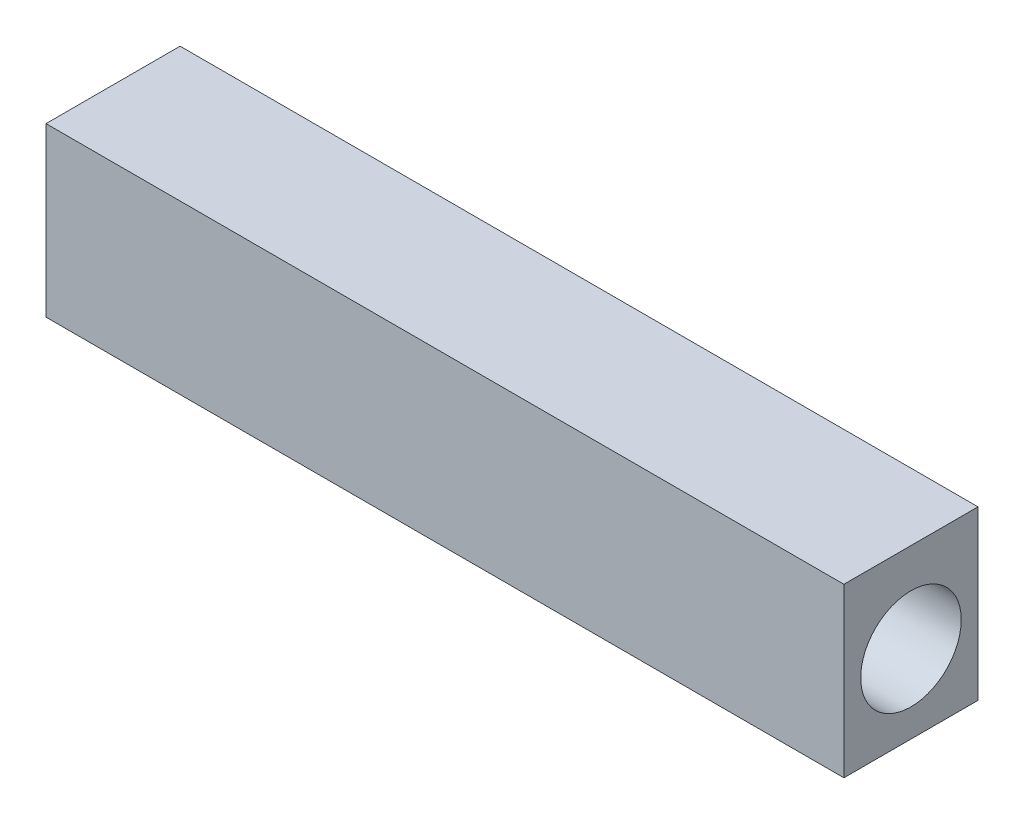
ISO-10303-21;
HEADER;
FILE_DESCRIPTION(('STEP AP214'),'2;1');
FILE_NAME('part.step','',(''),(''),'','','');
FILE_SCHEMA(('AUTOMOTIVE_DESIGN { 1 0 10303 214 1 1 1 1 }'));
ENDSEC;
DATA;
#1=APPLICATION_CONTEXT('core data for automotive mechanical design processes');
#2=APPLICATION_PROTOCOL_DEFINITION('international standard','automotive_design',2000,#1);
#3=PRODUCT_CONTEXT('',#1,'mechanical');
#4=PRODUCT('Part','Part','',(#3));
#5=PRODUCT_RELATED_PRODUCT_CATEGORY('part','',(#4));
#6=PRODUCT_DEFINITION_FORMATION('','',#4);
#7=PRODUCT_DEFINITION_CONTEXT('part definition',#1,'design');
#8=PRODUCT_DEFINITION('design','',#6,#7);
#9=PRODUCT_DEFINITION_SHAPE('','',#8);
#10=(LENGTH_UNIT() NAMED_UNIT(*) SI_UNIT(.MILLI.,.METRE.));
#11=(NAMED_UNIT(*) PLANE_ANGLE_UNIT() SI_UNIT($,.RADIAN.));
#12=(NAMED_UNIT(*) SI_UNIT($,.STERADIAN.) SOLID_ANGLE_UNIT());
#13=UNCERTAINTY_MEASURE_WITH_UNIT(LENGTH_MEASURE(1.E-05),#10,'distance_accuracy_value','');
#14=(GEOMETRIC_REPRESENTATION_CONTEXT(3) GLOBAL_UNCERTAINTY_ASSIGNED_CONTEXT((#13)) GLOBAL_UNIT_ASSIGNED_CONTEXT((#10,
#11,#12)) REPRESENTATION_CONTEXT('',''));
#15=CARTESIAN_POINT('',(0.,0.,0.));
#16=DIRECTION('',(0.,0.,1.));
#17=DIRECTION('',(1.,0.,0.));
#18=AXIS2_PLACEMENT_3D('',#15,#16,#17);
#19=CARTESIAN_POINT('',(-16.2,10.,-6.));
#20=DIRECTION('',(0.,0.,1.));
#21=DIRECTION('',(1.,0.,0.));
#22=AXIS2_PLACEMENT_3D('',#19,#20,#21);
#23=PLANE('',#22);
#24=DIRECTION('',(-1.,0.,0.));
#25=VECTOR('',#24,1.);
#26=CARTESIAN_POINT('',(-16.2,0.,-6.));
#27=LINE('',#26,#25);
#28=CARTESIAN_POINT('',(55.2,0.,-6.0000000000001));
#29=VERTEX_POINT('',#28);
#30=CARTESIAN_POINT('',(-16.2,0.,-6.));
#31=VERTEX_POINT('',#30);
#32=EDGE_CURVE('E112',#29,#31,#27,.T.);
#33=ORIENTED_EDGE('',*,*,#32,.T.);
#34=DIRECTION('',(0.,-1.,0.));
#35=VECTOR('',#34,1.);
#36=CARTESIAN_POINT('',(-16.2,10.,-6.));
#37=LINE('',#36,#35);
#38=CARTESIAN_POINT('',(-16.2,15.,-6.00000000000011));
#39=VERTEX_POINT('',#38);
#40=EDGE_CURVE('E40',#39,#31,#37,.T.);
#41=ORIENTED_EDGE('',*,*,#40,.F.);
#42=DIRECTION('',(-1.,0.,0.));
#43=VECTOR('',#42,1.);
#44=CARTESIAN_POINT('',(-16.2,15.,-6.00000000000011));
#45=LINE('',#44,#43);
#46=CARTESIAN_POINT('',(55.2,15.,-6.0000000000001));
#47=VERTEX_POINT('',#46);
#48=EDGE_CURVE('E73',#47,#39,#45,.T.);
#49=ORIENTED_EDGE('',*,*,#48,.F.);
#50=DIRECTION('',(0.,1.,0.));
#51=VECTOR('',#50,1.);
#52=CARTESIAN_POINT('',(55.2,15.,-6.0000000000001));
#53=LINE('',#52,#51);
#54=EDGE_CURVE('E76',#29,#47,#53,.T.);
#55=ORIENTED_EDGE('',*,*,#54,.F.);
#56=EDGE_LOOP('',(#33,#41,#49,#55));
#57=FACE_BOUND('',#56,.T.);
#58=ADVANCED_FACE('F33',(#57),#23,.F.);
#59=CARTESIAN_POINT('',(-16.2,10.,-6.));
#60=DIRECTION('',(1.,0.,0.));
#61=DIRECTION('',(0.,0.,-1.));
#62=AXIS2_PLACEMENT_3D('',#59,#60,#61);
#63=PLANE('',#62);
#64=DIRECTION('',(0.,0.,1.));
#65=VECTOR('',#64,1.);
#66=CARTESIAN_POINT('',(-16.2,0.,-6.));
#67=LINE('',#66,#65);
#68=CARTESIAN_POINT('',(-16.2,0.,6.));
#69=VERTEX_POINT('',#68);
#70=EDGE_CURVE('E116',#31,#69,#67,.T.);
#71=ORIENTED_EDGE('',*,*,#70,.T.);
#72=DIRECTION('',(0.,-1.,0.));
#73=VECTOR('',#72,1.);
#74=CARTESIAN_POINT('',(-16.2,10.,6.));
#75=LINE('',#74,#73);
#76=CARTESIAN_POINT('',(-16.2,15.,6.00000000000011));
#77=VERTEX_POINT('',#76);
#78=EDGE_CURVE('E47',#77,#69,#75,.T.);
#79=ORIENTED_EDGE('',*,*,#78,.F.);
#80=DIRECTION('',(0.,0.,1.));
#81=VECTOR('',#80,1.);
#82=CARTESIAN_POINT('',(-16.2,15.,-6.00000000000011));
#83=LINE('',#82,#81);
#84=EDGE_CURVE('E79',#39,#77,#83,.T.);
#85=ORIENTED_EDGE('',*,*,#84,.F.);
#86=ORIENTED_EDGE('',*,*,#40,.T.);
#87=EDGE_LOOP('',(#71,#79,#85,#86));
#88=FACE_BOUND('',#87,.T.);
#89=CARTESIAN_POINT('',(-16.2,7.,0.));
#90=DIRECTION('',(-1.,0.,0.));
#91=DIRECTION('',(0.,0.,1.));
#92=AXIS2_PLACEMENT_3D('',#89,#90,#91);
#93=CIRCLE('',#92,4.);
#94=CARTESIAN_POINT('',(-16.2,7.,4.));
#95=VERTEX_POINT('',#94);
#96=EDGE_CURVE('E108',#95,#95,#93,.T.);
#97=ORIENTED_EDGE('',*,*,#96,.F.);
#98=EDGE_LOOP('',(#97));
#99=FACE_BOUND('',#98,.T.);
#100=ADVANCED_FACE('F125',(#88,#99),#63,.F.);
#101=CARTESIAN_POINT('',(-16.2,10.,6.));
#102=DIRECTION('',(0.,0.,-1.));
#103=DIRECTION('',(-1.,0.,0.));
#104=AXIS2_PLACEMENT_3D('',#101,#102,#103);
#105=PLANE('',#104);
#106=DIRECTION('',(1.,0.,0.));
#107=VECTOR('',#106,1.);
#108=CARTESIAN_POINT('',(-16.2,0.,6.));
#109=LINE('',#108,#107);
#110=CARTESIAN_POINT('',(55.2,0.,6.00000000000001));
#111=VERTEX_POINT('',#110);
#112=EDGE_CURVE('E118',#69,#111,#109,.T.);
#113=ORIENTED_EDGE('',*,*,#112,.T.);
#114=DIRECTION('',(0.,-1.,0.));
#115=VECTOR('',#114,1.);
#116=CARTESIAN_POINT('',(55.2,15.,6.00000000000001));
#117=LINE('',#116,#115);
#118=CARTESIAN_POINT('',(55.2,15.,6.00000000000001));
#119=VERTEX_POINT('',#118);
#120=EDGE_CURVE('E88',#119,#111,#117,.T.);
#121=ORIENTED_EDGE('',*,*,#120,.F.);
#122=DIRECTION('',(1.,0.,0.));
#123=VECTOR('',#122,1.);
#124=CARTESIAN_POINT('',(-16.2,15.,6.00000000000011));
#125=LINE('',#124,#123);
#126=EDGE_CURVE('E84',#77,#119,#125,.T.);
#127=ORIENTED_EDGE('',*,*,#126,.F.);
#128=ORIENTED_EDGE('',*,*,#78,.T.);
#129=EDGE_LOOP('',(#113,#121,#127,#128));
#130=FACE_BOUND('',#129,.T.);
#131=ADVANCED_FACE('F121',(#130),#105,.F.);
#132=CARTESIAN_POINT('',(0.,0.,0.));
#133=DIRECTION('',(0.,1.,0.));
#134=DIRECTION('',(0.,0.,1.));
#135=AXIS2_PLACEMENT_3D('',#132,#133,#134);
#136=PLANE('',#135);
#137=ORIENTED_EDGE('',*,*,#32,.F.);
#138=DIRECTION('',(0.,0.,-1.));
#139=VECTOR('',#138,1.);
#140=CARTESIAN_POINT('',(55.2,0.,-6.0000000000001));
#141=LINE('',#140,#139);
#142=EDGE_CURVE('E93',#111,#29,#141,.T.);
#143=ORIENTED_EDGE('',*,*,#142,.F.);
#144=ORIENTED_EDGE('',*,*,#112,.F.);
#145=ORIENTED_EDGE('',*,*,#70,.F.);
#146=EDGE_LOOP('',(#137,#143,#144,#145));
#147=FACE_BOUND('',#146,.T.);
#148=ADVANCED_FACE('F124',(#147),#136,.F.);
#149=CARTESIAN_POINT('',(-7.7,7.,0.));
#150=DIRECTION('',(-1.,0.,0.));
#151=DIRECTION('',(0.,0.,1.));
#152=AXIS2_PLACEMENT_3D('',#149,#150,#151);
#153=CYLINDRICAL_SURFACE('',#152,4.);
#154=CARTESIAN_POINT('',(-7.7,7.,0.));
#155=DIRECTION('',(-1.,0.,0.));
#156=DIRECTION('',(0.,0.,1.));
#157=AXIS2_PLACEMENT_3D('',#154,#155,#156);
#158=CIRCLE('',#157,4.);
#159=CARTESIAN_POINT('',(-7.7,7.,4.));
#160=VERTEX_POINT('',#159);
#161=EDGE_CURVE('E109',#160,#160,#158,.T.);
#162=ORIENTED_EDGE('',*,*,#161,.F.);
#163=EDGE_LOOP('',(#162));
#164=FACE_BOUND('',#163,.T.);
#165=ORIENTED_EDGE('',*,*,#96,.T.);
#166=EDGE_LOOP('',(#165));
#167=FACE_BOUND('',#166,.T.);
#168=ADVANCED_FACE('F130',(#164,#167),#153,.F.);
#169=CARTESIAN_POINT('',(-7.7,7.,0.));
#170=DIRECTION('',(-1.,0.,0.));
#171=DIRECTION('',(0.,0.,1.));
#172=AXIS2_PLACEMENT_3D('',#169,#170,#171);
#173=PLANE('',#172);
#174=CARTESIAN_POINT('',(-7.7,7.,0.));
#175=DIRECTION('',(-1.,0.,0.));
#176=DIRECTION('',(0.,0.,1.));
#177=AXIS2_PLACEMENT_3D('',#174,#175,#176);
#178=CIRCLE('',#177,3.4);
#179=CARTESIAN_POINT('',(-7.7,7.,3.4));
#180=VERTEX_POINT('',#179);
#181=EDGE_CURVE('E11',#180,#180,#178,.T.);
#182=ORIENTED_EDGE('',*,*,#181,.F.);
#183=EDGE_LOOP('',(#182));
#184=FACE_BOUND('',#183,.T.);
#185=ORIENTED_EDGE('',*,*,#161,.T.);
#186=EDGE_LOOP('',(#185));
#187=FACE_BOUND('',#186,.T.);
#188=ADVANCED_FACE('F132',(#184,#187),#173,.T.);
#189=CARTESIAN_POINT('',(0.199999999999999,7.,0.));
#190=DIRECTION('',(-1.,0.,0.));
#191=DIRECTION('',(0.,0.,1.));
#192=AXIS2_PLACEMENT_3D('',#189,#190,#191);
#193=CYLINDRICAL_SURFACE('',#192,3.4);
#194=CARTESIAN_POINT('',(0.199999999999999,7.,0.));
#195=DIRECTION('',(-1.,0.,0.));
#196=DIRECTION('',(0.,0.,1.));
#197=AXIS2_PLACEMENT_3D('',#194,#195,#196);
#198=CIRCLE('',#197,3.4);
#199=CARTESIAN_POINT('',(0.199999999999999,7.,3.4));
#200=VERTEX_POINT('',#199);
#201=EDGE_CURVE('E105',#200,#200,#198,.T.);
#202=ORIENTED_EDGE('',*,*,#201,.F.);
#203=EDGE_LOOP('',(#202));
#204=FACE_BOUND('',#203,.T.);
#205=ORIENTED_EDGE('',*,*,#181,.T.);
#206=EDGE_LOOP('',(#205));
#207=FACE_BOUND('',#206,.T.);
#208=ADVANCED_FACE('F139',(#204,#207),#193,.F.);
#209=CARTESIAN_POINT('',(0.199999999999992,7.,0.));
#210=DIRECTION('',(1.,0.,0.));
#211=DIRECTION('',(0.,0.,-1.));
#212=AXIS2_PLACEMENT_3D('',#209,#210,#211);
#213=PLANE('',#212);
#214=CARTESIAN_POINT('',(0.199999999999992,7.,0.));
#215=DIRECTION('',(1.,0.,0.));
#216=DIRECTION('',(0.,0.,-1.));
#217=AXIS2_PLACEMENT_3D('',#214,#215,#216);
#218=CIRCLE('',#217,4.5);
#219=CARTESIAN_POINT('',(0.199999999999993,7.,-4.49999999999999));
#220=VERTEX_POINT('',#219);
#221=EDGE_CURVE('E78',#220,#220,#218,.T.);
#222=ORIENTED_EDGE('',*,*,#221,.T.);
#223=EDGE_LOOP('',(#222));
#224=FACE_BOUND('',#223,.T.);
#225=ORIENTED_EDGE('',*,*,#201,.T.);
#226=EDGE_LOOP('',(#225));
#227=FACE_BOUND('',#226,.T.);
#228=ADVANCED_FACE('F184',(#224,#227),#213,.T.);
#229=CARTESIAN_POINT('',(0.199999999999992,7.,0.));
#230=DIRECTION('',(1.,0.,0.));
#231=DIRECTION('',(0.,0.,-1.));
#232=AXIS2_PLACEMENT_3D('',#229,#230,#231);
#233=CYLINDRICAL_SURFACE('',#232,4.5);
#234=ORIENTED_EDGE('',*,*,#221,.F.);
#235=EDGE_LOOP('',(#234));
#236=FACE_BOUND('',#235,.T.);
#237=CARTESIAN_POINT('',(55.2,7.,0.));
#238=DIRECTION('',(1.,0.,0.));
#239=DIRECTION('',(0.,0.,-1.));
#240=AXIS2_PLACEMENT_3D('',#237,#238,#239);
#241=CIRCLE('',#240,4.5);
#242=CARTESIAN_POINT('',(55.2,7.,-4.49999999999998));
#243=VERTEX_POINT('',#242);
#244=EDGE_CURVE('E94',#243,#243,#241,.T.);
#245=ORIENTED_EDGE('',*,*,#244,.T.);
#246=EDGE_LOOP('',(#245));
#247=FACE_BOUND('',#246,.T.);
#248=ADVANCED_FACE('F172',(#236,#247),#233,.F.);
#249=CARTESIAN_POINT('',(0.,15.,0.));
#250=DIRECTION('',(0.,1.,0.));
#251=DIRECTION('',(0.,0.,1.));
#252=AXIS2_PLACEMENT_3D('',#249,#250,#251);
#253=PLANE('',#252);
#254=ORIENTED_EDGE('',*,*,#126,.T.);
#255=DIRECTION('',(0.,0.,1.));
#256=VECTOR('',#255,1.);
#257=CARTESIAN_POINT('',(55.2,15.,-6.0000000000001));
#258=LINE('',#257,#256);
#259=EDGE_CURVE('E82',#47,#119,#258,.T.);
#260=ORIENTED_EDGE('',*,*,#259,.F.);
#261=ORIENTED_EDGE('',*,*,#48,.T.);
#262=ORIENTED_EDGE('',*,*,#84,.T.);
#263=EDGE_LOOP('',(#254,#260,#261,#262));
#264=FACE_BOUND('',#263,.T.);
#265=ADVANCED_FACE('F83',(#264),#253,.T.);
#266=CARTESIAN_POINT('',(55.2,0.,0.));
#267=DIRECTION('',(-1.,0.,0.));
#268=DIRECTION('',(0.,0.,1.));
#269=AXIS2_PLACEMENT_3D('',#266,#267,#268);
#270=PLANE('',#269);
#271=ORIENTED_EDGE('',*,*,#244,.F.);
#272=EDGE_LOOP('',(#271));
#273=FACE_BOUND('',#272,.T.);
#274=ORIENTED_EDGE('',*,*,#54,.T.);
#275=ORIENTED_EDGE('',*,*,#259,.T.);
#276=ORIENTED_EDGE('',*,*,#120,.T.);
#277=ORIENTED_EDGE('',*,*,#142,.T.);
#278=EDGE_LOOP('',(#274,#275,#276,#277));
#279=FACE_BOUND('',#278,.T.);
#280=ADVANCED_FACE('F91',(#273,#279),#270,.F.);
#281=CLOSED_SHELL('',(#58,#100,#131,#148,#168,#188,#208,#228,#248,#265,#280));
#282=MANIFOLD_SOLID_BREP('B2',#281);
#283=ADVANCED_BREP_SHAPE_REPRESENTATION('',(#18,#282),#14);
#284=SHAPE_DEFINITION_REPRESENTATION(#9,#283);
ENDSEC;
END-ISO-10303-21;
